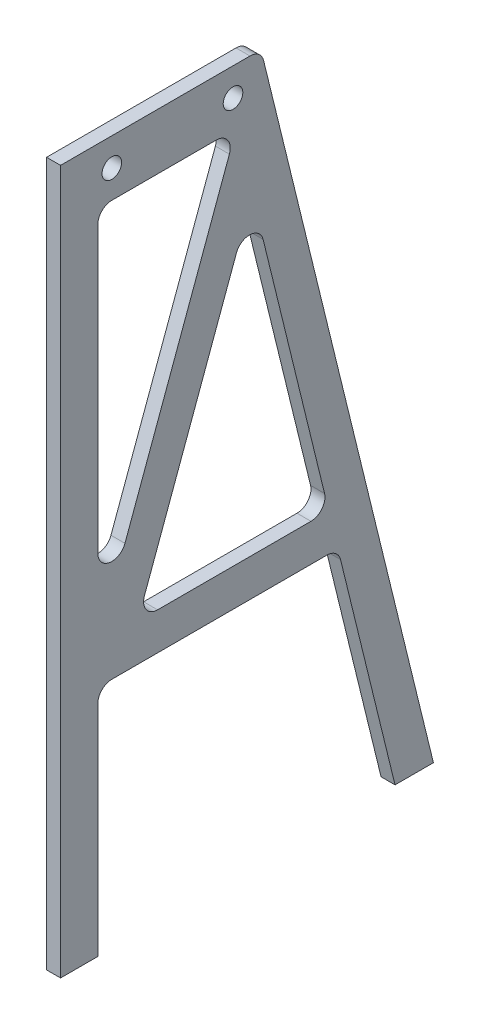
ISO-10303-21;
HEADER;
FILE_DESCRIPTION(('STEP AP214'),'2;1');
FILE_NAME('part.step','',(''),(''),'','','');
FILE_SCHEMA(('AUTOMOTIVE_DESIGN { 1 0 10303 214 1 1 1 1 }'));
ENDSEC;
DATA;
#1=APPLICATION_CONTEXT('core data for automotive mechanical design processes');
#2=APPLICATION_PROTOCOL_DEFINITION('international standard','automotive_design',2000,#1);
#3=PRODUCT_CONTEXT('',#1,'mechanical');
#4=PRODUCT('Part','Part','',(#3));
#5=PRODUCT_RELATED_PRODUCT_CATEGORY('part','',(#4));
#6=PRODUCT_DEFINITION_FORMATION('','',#4);
#7=PRODUCT_DEFINITION_CONTEXT('part definition',#1,'design');
#8=PRODUCT_DEFINITION('design','',#6,#7);
#9=PRODUCT_DEFINITION_SHAPE('','',#8);
#10=(LENGTH_UNIT() NAMED_UNIT(*) SI_UNIT(.MILLI.,.METRE.));
#11=(NAMED_UNIT(*) PLANE_ANGLE_UNIT() SI_UNIT($,.RADIAN.));
#12=(NAMED_UNIT(*) SI_UNIT($,.STERADIAN.) SOLID_ANGLE_UNIT());
#13=UNCERTAINTY_MEASURE_WITH_UNIT(LENGTH_MEASURE(1.E-05),#10,'distance_accuracy_value','');
#14=(GEOMETRIC_REPRESENTATION_CONTEXT(3) GLOBAL_UNCERTAINTY_ASSIGNED_CONTEXT((#13)) GLOBAL_UNIT_ASSIGNED_CONTEXT((#10,
#11,#12)) REPRESENTATION_CONTEXT('',''));
#15=CARTESIAN_POINT('',(0.,0.,0.));
#16=DIRECTION('',(0.,0.,1.));
#17=DIRECTION('',(1.,0.,0.));
#18=AXIS2_PLACEMENT_3D('',#15,#16,#17);
#19=CARTESIAN_POINT('',(1.5,0.,0.));
#20=DIRECTION('',(-1.,0.,0.));
#21=DIRECTION('',(0.,0.,1.));
#22=AXIS2_PLACEMENT_3D('',#19,#20,#21);
#23=PLANE('',#22);
#24=DIRECTION('',(0.,-1.,0.));
#25=VECTOR('',#24,1.);
#26=CARTESIAN_POINT('',(1.5,29.,-4.));
#27=LINE('',#26,#25);
#28=CARTESIAN_POINT('',(1.5,68.,-3.99999999999999));
#29=VERTEX_POINT('',#28);
#30=CARTESIAN_POINT('',(1.5,37.4471518851589,-3.99999999999999));
#31=VERTEX_POINT('',#30);
#32=EDGE_CURVE('E380',#29,#31,#27,.T.);
#33=ORIENTED_EDGE('',*,*,#32,.F.);
#34=CARTESIAN_POINT('',(1.5,68.,-5.49999999999999));
#35=DIRECTION('',(-1.,0.,0.));
#36=DIRECTION('',(0.,0.,1.));
#37=AXIS2_PLACEMENT_3D('',#34,#35,#36);
#38=CIRCLE('',#37,1.5);
#39=CARTESIAN_POINT('',(1.5,69.5,-5.49999999999999));
#40=VERTEX_POINT('',#39);
#41=EDGE_CURVE('E328',#29,#40,#38,.T.);
#42=ORIENTED_EDGE('',*,*,#41,.T.);
#43=DIRECTION('',(0.,0.,1.));
#44=VECTOR('',#43,1.);
#45=CARTESIAN_POINT('',(1.5,69.5,-3.99999999999999));
#46=LINE('',#45,#44);
#47=CARTESIAN_POINT('',(1.5,69.5,-16.7041190731602));
#48=VERTEX_POINT('',#47);
#49=EDGE_CURVE('E389',#48,#40,#46,.T.);
#50=ORIENTED_EDGE('',*,*,#49,.F.);
#51=CARTESIAN_POINT('',(1.5,68.,-16.7041190731602));
#52=DIRECTION('',(-1.,0.,0.));
#53=DIRECTION('',(0.,0.,1.));
#54=AXIS2_PLACEMENT_3D('',#51,#52,#53);
#55=CIRCLE('',#54,1.5);
#56=CARTESIAN_POINT('',(1.5,67.4835608141741,-18.112412567906));
#57=VERTEX_POINT('',#56);
#58=EDGE_CURVE('E334',#48,#57,#55,.T.);
#59=ORIENTED_EDGE('',*,*,#58,.T.);
#60=DIRECTION('',(0.,0.938862329830578,-0.34429279055057));
#61=VECTOR('',#60,1.);
#62=CARTESIAN_POINT('',(1.5,69.5,-18.8518665349097));
#63=LINE('',#62,#61);
#64=CARTESIAN_POINT('',(1.5,36.930712699333,-6.90829349474586));
#65=VERTEX_POINT('',#64);
#66=EDGE_CURVE('E384',#65,#57,#63,.T.);
#67=ORIENTED_EDGE('',*,*,#66,.F.);
#68=CARTESIAN_POINT('',(1.5,37.4471518851589,-5.5));
#69=DIRECTION('',(-1.,0.,0.));
#70=DIRECTION('',(0.,0.,1.));
#71=AXIS2_PLACEMENT_3D('',#68,#69,#70);
#72=CIRCLE('',#71,1.5);
#73=EDGE_CURVE('E304',#65,#31,#72,.T.);
#74=ORIENTED_EDGE('',*,*,#73,.T.);
#75=EDGE_LOOP('',(#33,#42,#50,#59,#67,#74));
#76=FACE_BOUND('',#75,.T.);
#77=DIRECTION('',(0.,0.971266974943367,0.237992570019236));
#78=VECTOR('',#77,1.);
#79=CARTESIAN_POINT('',(1.5,75.5,-21.5));
#80=LINE('',#79,#78);
#81=CARTESIAN_POINT('',(1.5,0.,-40.));
#82=VERTEX_POINT('',#81);
#83=CARTESIAN_POINT('',(1.5,74.3569888550288,-21.7800755785691));
#84=VERTEX_POINT('',#83);
#85=EDGE_CURVE('E428',#82,#84,#80,.T.);
#86=ORIENTED_EDGE('',*,*,#85,.T.);
#87=CARTESIAN_POINT('',(1.5,74.,-20.323175116154));
#88=DIRECTION('',(-1.,0.,0.));
#89=DIRECTION('',(0.,0.,1.));
#90=AXIS2_PLACEMENT_3D('',#87,#88,#89);
#91=CIRCLE('',#90,1.5);
#92=CARTESIAN_POINT('',(1.5,75.5,-20.323175116154));
#93=VERTEX_POINT('',#92);
#94=EDGE_CURVE('E244',#84,#93,#91,.F.);
#95=ORIENTED_EDGE('',*,*,#94,.T.);
#96=DIRECTION('',(0.,0.,1.));
#97=VECTOR('',#96,1.);
#98=CARTESIAN_POINT('',(1.5,75.5,-21.5));
#99=LINE('',#98,#97);
#100=CARTESIAN_POINT('',(1.5,75.5,0.));
#101=VERTEX_POINT('',#100);
#102=EDGE_CURVE('E431',#93,#101,#99,.T.);
#103=ORIENTED_EDGE('',*,*,#102,.T.);
#104=DIRECTION('',(0.,-1.,0.));
#105=VECTOR('',#104,1.);
#106=CARTESIAN_POINT('',(1.5,0.,0.));
#107=LINE('',#106,#105);
#108=CARTESIAN_POINT('',(1.5,0.,0.));
#109=VERTEX_POINT('',#108);
#110=EDGE_CURVE('E215',#101,#109,#107,.T.);
#111=ORIENTED_EDGE('',*,*,#110,.T.);
#112=DIRECTION('',(0.,0.,-1.));
#113=VECTOR('',#112,1.);
#114=CARTESIAN_POINT('',(1.5,0.,-4.));
#115=LINE('',#114,#113);
#116=CARTESIAN_POINT('',(1.5,0.,-4.));
#117=VERTEX_POINT('',#116);
#118=EDGE_CURVE('E209',#109,#117,#115,.T.);
#119=ORIENTED_EDGE('',*,*,#118,.T.);
#120=DIRECTION('',(0.,1.,0.));
#121=VECTOR('',#120,1.);
#122=CARTESIAN_POINT('',(1.5,25.,-4.));
#123=LINE('',#122,#121);
#124=CARTESIAN_POINT('',(1.5,23.5,-4.));
#125=VERTEX_POINT('',#124);
#126=EDGE_CURVE('E196',#117,#125,#123,.T.);
#127=ORIENTED_EDGE('',*,*,#126,.T.);
#128=CARTESIAN_POINT('',(1.5,23.5,-5.5));
#129=DIRECTION('',(-1.,0.,0.));
#130=DIRECTION('',(0.,0.,1.));
#131=AXIS2_PLACEMENT_3D('',#128,#129,#130);
#132=CIRCLE('',#131,1.5);
#133=CARTESIAN_POINT('',(1.5,25.,-5.50000000000001));
#134=VERTEX_POINT('',#133);
#135=EDGE_CURVE('E322',#125,#134,#132,.T.);
#136=ORIENTED_EDGE('',*,*,#135,.T.);
#137=DIRECTION('',(0.,0.,-1.));
#138=VECTOR('',#137,1.);
#139=CARTESIAN_POINT('',(1.5,25.,-29.7558400448434));
#140=LINE('',#139,#138);
#141=CARTESIAN_POINT('',(1.5,25.,-28.5790151609975));
#142=VERTEX_POINT('',#141);
#143=EDGE_CURVE('E208',#134,#142,#140,.T.);
#144=ORIENTED_EDGE('',*,*,#143,.T.);
#145=CARTESIAN_POINT('',(1.5,23.5,-28.5790151609975));
#146=DIRECTION('',(-1.,0.,0.));
#147=DIRECTION('',(0.,0.,1.));
#148=AXIS2_PLACEMENT_3D('',#145,#146,#147);
#149=CIRCLE('',#148,1.5);
#150=CARTESIAN_POINT('',(1.5,23.8569888550289,-30.0359156234125));
#151=VERTEX_POINT('',#150);
#152=EDGE_CURVE('E316',#142,#151,#149,.T.);
#153=ORIENTED_EDGE('',*,*,#152,.T.);
#154=DIRECTION('',(0.,-0.971266974943367,-0.237992570019236));
#155=VECTOR('',#154,1.);
#156=CARTESIAN_POINT('',(1.5,0.,-35.881667859413));
#157=LINE('',#156,#155);
#158=CARTESIAN_POINT('',(1.5,0.,-35.881667859413));
#159=VERTEX_POINT('',#158);
#160=EDGE_CURVE('E422',#151,#159,#157,.T.);
#161=ORIENTED_EDGE('',*,*,#160,.T.);
#162=DIRECTION('',(0.,0.,-1.));
#163=VECTOR('',#162,1.);
#164=CARTESIAN_POINT('',(1.5,0.,-40.));
#165=LINE('',#164,#163);
#166=EDGE_CURVE('E425',#159,#82,#165,.T.);
#167=ORIENTED_EDGE('',*,*,#166,.T.);
#168=EDGE_LOOP('',(#86,#95,#103,#111,#119,#127,#136,#144,#153,#161,#167));
#169=FACE_BOUND('',#168,.T.);
#170=CARTESIAN_POINT('',(1.5,72.5,-5.5));
#171=DIRECTION('',(1.,0.,0.));
#172=DIRECTION('',(0.,0.,-1.));
#173=AXIS2_PLACEMENT_3D('',#170,#171,#172);
#174=CIRCLE('',#173,1.04999999999999);
#175=CARTESIAN_POINT('',(1.5,72.5,-6.54999999999999));
#176=VERTEX_POINT('',#175);
#177=EDGE_CURVE('E412',#176,#176,#174,.T.);
#178=ORIENTED_EDGE('',*,*,#177,.F.);
#179=EDGE_LOOP('',(#178));
#180=FACE_BOUND('',#179,.T.);
#181=CARTESIAN_POINT('',(1.5,72.5,-18.5));
#182=DIRECTION('',(1.,0.,0.));
#183=DIRECTION('',(0.,0.,-1.));
#184=AXIS2_PLACEMENT_3D('',#181,#182,#183);
#185=CIRCLE('',#184,1.05);
#186=CARTESIAN_POINT('',(1.5,72.5,-19.55));
#187=VERTEX_POINT('',#186);
#188=EDGE_CURVE('E404',#187,#187,#185,.T.);
#189=ORIENTED_EDGE('',*,*,#188,.F.);
#190=EDGE_LOOP('',(#189));
#191=FACE_BOUND('',#190,.T.);
#192=DIRECTION('',(0.,0.,-1.));
#193=VECTOR('',#192,1.);
#194=CARTESIAN_POINT('',(1.5,29.,-28.7757075945123));
#195=LINE('',#194,#193);
#196=CARTESIAN_POINT('',(1.5,29.,-10.4082230106213));
#197=VERTEX_POINT('',#196);
#198=CARTESIAN_POINT('',(1.5,29.,-26.863783372918));
#199=VERTEX_POINT('',#198);
#200=EDGE_CURVE('E359',#197,#199,#195,.T.);
#201=ORIENTED_EDGE('',*,*,#200,.F.);
#202=CARTESIAN_POINT('',(1.5,30.5,-10.4082230106213));
#203=DIRECTION('',(-1.,0.,0.));
#204=DIRECTION('',(0.,0.,1.));
#205=AXIS2_PLACEMENT_3D('',#202,#203,#204);
#206=CIRCLE('',#205,1.5);
#207=CARTESIAN_POINT('',(1.5,31.0164391858259,-8.99992951587546));
#208=VERTEX_POINT('',#207);
#209=EDGE_CURVE('E310',#197,#208,#206,.T.);
#210=ORIENTED_EDGE('',*,*,#209,.T.);
#211=DIRECTION('',(0.,-0.938862329830578,0.34429279055057));
#212=VECTOR('',#211,1.);
#213=CARTESIAN_POINT('',(1.5,29.,-8.26047554887181));
#214=LINE('',#213,#212);
#215=CARTESIAN_POINT('',(1.5,57.915779684203,-18.8642607494307));
#216=VERTEX_POINT('',#215);
#217=EDGE_CURVE('E369',#216,#208,#214,.T.);
#218=ORIENTED_EDGE('',*,*,#217,.F.);
#219=CARTESIAN_POINT('',(1.5,57.3993404983772,-20.2725542441766));
#220=DIRECTION('',(-1.,0.,0.));
#221=DIRECTION('',(0.,0.,1.));
#222=AXIS2_PLACEMENT_3D('',#219,#220,#221);
#223=CIRCLE('',#222,1.5);
#224=CARTESIAN_POINT('',(1.5,57.756329353406,-21.7294547065916));
#225=VERTEX_POINT('',#224);
#226=EDGE_CURVE('E55',#216,#225,#223,.T.);
#227=ORIENTED_EDGE('',*,*,#226,.T.);
#228=DIRECTION('',(0.,0.971266974943367,0.237992570019236));
#229=VECTOR('',#228,1.);
#230=CARTESIAN_POINT('',(1.5,62.5355466510459,-20.5583882164415));
#231=LINE('',#230,#229);
#232=CARTESIAN_POINT('',(1.5,30.8569888550289,-28.3206838353331));
#233=VERTEX_POINT('',#232);
#234=EDGE_CURVE('E361',#233,#225,#231,.T.);
#235=ORIENTED_EDGE('',*,*,#234,.F.);
#236=CARTESIAN_POINT('',(1.5,30.5,-26.863783372918));
#237=DIRECTION('',(-1.,0.,0.));
#238=DIRECTION('',(0.,0.,1.));
#239=AXIS2_PLACEMENT_3D('',#236,#237,#238);
#240=CIRCLE('',#239,1.5);
#241=EDGE_CURVE('E11',#233,#199,#240,.T.);
#242=ORIENTED_EDGE('',*,*,#241,.T.);
#243=EDGE_LOOP('',(#201,#210,#218,#227,#235,#242));
#244=FACE_BOUND('',#243,.T.);
#245=ADVANCED_FACE('F39',(#76,#169,#180,#191,#244),#23,.F.);
#246=CARTESIAN_POINT('',(0.,0.,0.));
#247=DIRECTION('',(-1.,0.,0.));
#248=DIRECTION('',(0.,0.,1.));
#249=AXIS2_PLACEMENT_3D('',#246,#247,#248);
#250=PLANE('',#249);
#251=CARTESIAN_POINT('',(0.,72.5,-5.5));
#252=DIRECTION('',(1.,0.,0.));
#253=DIRECTION('',(0.,0.,-1.));
#254=AXIS2_PLACEMENT_3D('',#251,#252,#253);
#255=CIRCLE('',#254,1.04999999999999);
#256=CARTESIAN_POINT('',(0.,72.5,-6.54999999999999));
#257=VERTEX_POINT('',#256);
#258=EDGE_CURVE('E408',#257,#257,#255,.T.);
#259=ORIENTED_EDGE('',*,*,#258,.T.);
#260=EDGE_LOOP('',(#259));
#261=FACE_BOUND('',#260,.T.);
#262=DIRECTION('',(0.,0.,1.));
#263=VECTOR('',#262,1.);
#264=CARTESIAN_POINT('',(0.,75.5,-21.5));
#265=LINE('',#264,#263);
#266=CARTESIAN_POINT('',(0.,75.5,-20.323175116154));
#267=VERTEX_POINT('',#266);
#268=CARTESIAN_POINT('',(0.,75.5,0.));
#269=VERTEX_POINT('',#268);
#270=EDGE_CURVE('E456',#267,#269,#265,.T.);
#271=ORIENTED_EDGE('',*,*,#270,.F.);
#272=CARTESIAN_POINT('',(0.,74.,-20.323175116154));
#273=DIRECTION('',(-1.,0.,0.));
#274=DIRECTION('',(0.,0.,1.));
#275=AXIS2_PLACEMENT_3D('',#272,#273,#274);
#276=CIRCLE('',#275,1.5);
#277=CARTESIAN_POINT('',(0.,74.3569888550288,-21.7800755785691));
#278=VERTEX_POINT('',#277);
#279=EDGE_CURVE('E232',#267,#278,#276,.T.);
#280=ORIENTED_EDGE('',*,*,#279,.T.);
#281=DIRECTION('',(0.,0.971266974943367,0.237992570019236));
#282=VECTOR('',#281,1.);
#283=CARTESIAN_POINT('',(0.,75.5,-21.5));
#284=LINE('',#283,#282);
#285=CARTESIAN_POINT('',(0.,0.,-40.));
#286=VERTEX_POINT('',#285);
#287=EDGE_CURVE('E452',#286,#278,#284,.T.);
#288=ORIENTED_EDGE('',*,*,#287,.F.);
#289=DIRECTION('',(0.,0.,-1.));
#290=VECTOR('',#289,1.);
#291=CARTESIAN_POINT('',(0.,0.,-40.));
#292=LINE('',#291,#290);
#293=CARTESIAN_POINT('',(0.,0.,-35.881667859413));
#294=VERTEX_POINT('',#293);
#295=EDGE_CURVE('E449',#294,#286,#292,.T.);
#296=ORIENTED_EDGE('',*,*,#295,.F.);
#297=DIRECTION('',(0.,-0.971266974943367,-0.237992570019236));
#298=VECTOR('',#297,1.);
#299=CARTESIAN_POINT('',(0.,0.,-35.881667859413));
#300=LINE('',#299,#298);
#301=CARTESIAN_POINT('',(0.,23.8569888550289,-30.0359156234125));
#302=VERTEX_POINT('',#301);
#303=EDGE_CURVE('E446',#302,#294,#300,.T.);
#304=ORIENTED_EDGE('',*,*,#303,.F.);
#305=CARTESIAN_POINT('',(0.,23.5,-28.5790151609975));
#306=DIRECTION('',(-1.,0.,0.));
#307=DIRECTION('',(0.,0.,1.));
#308=AXIS2_PLACEMENT_3D('',#305,#306,#307);
#309=CIRCLE('',#308,1.5);
#310=CARTESIAN_POINT('',(0.,25.,-28.5790151609975));
#311=VERTEX_POINT('',#310);
#312=EDGE_CURVE('E313',#302,#311,#309,.F.);
#313=ORIENTED_EDGE('',*,*,#312,.T.);
#314=DIRECTION('',(0.,0.,-1.));
#315=VECTOR('',#314,1.);
#316=CARTESIAN_POINT('',(0.,25.,-29.7558400448434));
#317=LINE('',#316,#315);
#318=CARTESIAN_POINT('',(0.,25.,-5.50000000000001));
#319=VERTEX_POINT('',#318);
#320=EDGE_CURVE('E442',#319,#311,#317,.T.);
#321=ORIENTED_EDGE('',*,*,#320,.F.);
#322=CARTESIAN_POINT('',(0.,23.5,-5.5));
#323=DIRECTION('',(-1.,0.,0.));
#324=DIRECTION('',(0.,0.,1.));
#325=AXIS2_PLACEMENT_3D('',#322,#323,#324);
#326=CIRCLE('',#325,1.5);
#327=CARTESIAN_POINT('',(0.,23.5,-4.));
#328=VERTEX_POINT('',#327);
#329=EDGE_CURVE('E319',#319,#328,#326,.F.);
#330=ORIENTED_EDGE('',*,*,#329,.T.);
#331=DIRECTION('',(0.,1.,0.));
#332=VECTOR('',#331,1.);
#333=CARTESIAN_POINT('',(0.,25.,-4.));
#334=LINE('',#333,#332);
#335=CARTESIAN_POINT('',(0.,0.,-4.));
#336=VERTEX_POINT('',#335);
#337=EDGE_CURVE('E439',#336,#328,#334,.T.);
#338=ORIENTED_EDGE('',*,*,#337,.F.);
#339=DIRECTION('',(0.,0.,-1.));
#340=VECTOR('',#339,1.);
#341=CARTESIAN_POINT('',(0.,0.,-4.));
#342=LINE('',#341,#340);
#343=CARTESIAN_POINT('',(0.,0.,0.));
#344=VERTEX_POINT('',#343);
#345=EDGE_CURVE('E224',#344,#336,#342,.T.);
#346=ORIENTED_EDGE('',*,*,#345,.F.);
#347=DIRECTION('',(0.,-1.,0.));
#348=VECTOR('',#347,1.);
#349=CARTESIAN_POINT('',(0.,0.,0.));
#350=LINE('',#349,#348);
#351=EDGE_CURVE('E220',#269,#344,#350,.T.);
#352=ORIENTED_EDGE('',*,*,#351,.F.);
#353=EDGE_LOOP('',(#271,#280,#288,#296,#304,#313,#321,#330,#338,#346,#352));
#354=FACE_BOUND('',#353,.T.);
#355=CARTESIAN_POINT('',(0.,72.5,-18.5));
#356=DIRECTION('',(1.,0.,0.));
#357=DIRECTION('',(0.,0.,-1.));
#358=AXIS2_PLACEMENT_3D('',#355,#356,#357);
#359=CIRCLE('',#358,1.05);
#360=CARTESIAN_POINT('',(0.,72.5,-19.55));
#361=VERTEX_POINT('',#360);
#362=EDGE_CURVE('E393',#361,#361,#359,.T.);
#363=ORIENTED_EDGE('',*,*,#362,.T.);
#364=EDGE_LOOP('',(#363));
#365=FACE_BOUND('',#364,.T.);
#366=DIRECTION('',(0.,0.938862329830578,-0.34429279055057));
#367=VECTOR('',#366,1.);
#368=CARTESIAN_POINT('',(0.,69.5,-18.8518665349097));
#369=LINE('',#368,#367);
#370=CARTESIAN_POINT('',(0.,36.930712699333,-6.90829349474586));
#371=VERTEX_POINT('',#370);
#372=CARTESIAN_POINT('',(0.,67.4835608141741,-18.112412567906));
#373=VERTEX_POINT('',#372);
#374=EDGE_CURVE('E397',#371,#373,#369,.T.);
#375=ORIENTED_EDGE('',*,*,#374,.T.);
#376=CARTESIAN_POINT('',(0.,68.,-16.7041190731602));
#377=DIRECTION('',(-1.,0.,0.));
#378=DIRECTION('',(0.,0.,1.));
#379=AXIS2_PLACEMENT_3D('',#376,#377,#378);
#380=CIRCLE('',#379,1.5);
#381=CARTESIAN_POINT('',(0.,69.5,-16.7041190731602));
#382=VERTEX_POINT('',#381);
#383=EDGE_CURVE('E331',#373,#382,#380,.F.);
#384=ORIENTED_EDGE('',*,*,#383,.T.);
#385=DIRECTION('',(0.,0.,1.));
#386=VECTOR('',#385,1.);
#387=CARTESIAN_POINT('',(0.,69.5,-3.99999999999999));
#388=LINE('',#387,#386);
#389=CARTESIAN_POINT('',(0.,69.5,-5.49999999999999));
#390=VERTEX_POINT('',#389);
#391=EDGE_CURVE('E385',#382,#390,#388,.T.);
#392=ORIENTED_EDGE('',*,*,#391,.T.);
#393=CARTESIAN_POINT('',(0.,68.,-5.49999999999999));
#394=DIRECTION('',(-1.,0.,0.));
#395=DIRECTION('',(0.,0.,1.));
#396=AXIS2_PLACEMENT_3D('',#393,#394,#395);
#397=CIRCLE('',#396,1.5);
#398=CARTESIAN_POINT('',(0.,68.,-3.99999999999999));
#399=VERTEX_POINT('',#398);
#400=EDGE_CURVE('E325',#390,#399,#397,.F.);
#401=ORIENTED_EDGE('',*,*,#400,.T.);
#402=DIRECTION('',(0.,-1.,0.));
#403=VECTOR('',#402,1.);
#404=CARTESIAN_POINT('',(0.,29.,-4.));
#405=LINE('',#404,#403);
#406=CARTESIAN_POINT('',(0.,37.4471518851589,-3.99999999999999));
#407=VERTEX_POINT('',#406);
#408=EDGE_CURVE('E377',#399,#407,#405,.T.);
#409=ORIENTED_EDGE('',*,*,#408,.T.);
#410=CARTESIAN_POINT('',(0.,37.4471518851589,-5.5));
#411=DIRECTION('',(-1.,0.,0.));
#412=DIRECTION('',(0.,0.,1.));
#413=AXIS2_PLACEMENT_3D('',#410,#411,#412);
#414=CIRCLE('',#413,1.5);
#415=EDGE_CURVE('E301',#407,#371,#414,.F.);
#416=ORIENTED_EDGE('',*,*,#415,.T.);
#417=EDGE_LOOP('',(#375,#384,#392,#401,#409,#416));
#418=FACE_BOUND('',#417,.T.);
#419=DIRECTION('',(0.,0.971266974943367,0.237992570019236));
#420=VECTOR('',#419,1.);
#421=CARTESIAN_POINT('',(0.,62.5355466510459,-20.5583882164415));
#422=LINE('',#421,#420);
#423=CARTESIAN_POINT('',(0.,30.8569888550289,-28.3206838353331));
#424=VERTEX_POINT('',#423);
#425=CARTESIAN_POINT('',(0.,57.756329353406,-21.7294547065916));
#426=VERTEX_POINT('',#425);
#427=EDGE_CURVE('E346',#424,#426,#422,.T.);
#428=ORIENTED_EDGE('',*,*,#427,.T.);
#429=CARTESIAN_POINT('',(0.,57.3993404983772,-20.2725542441766));
#430=DIRECTION('',(-1.,0.,0.));
#431=DIRECTION('',(0.,0.,1.));
#432=AXIS2_PLACEMENT_3D('',#429,#430,#431);
#433=CIRCLE('',#432,1.5);
#434=CARTESIAN_POINT('',(0.,57.915779684203,-18.8642607494307));
#435=VERTEX_POINT('',#434);
#436=EDGE_CURVE('E337',#426,#435,#433,.F.);
#437=ORIENTED_EDGE('',*,*,#436,.T.);
#438=DIRECTION('',(0.,-0.938862329830578,0.34429279055057));
#439=VECTOR('',#438,1.);
#440=CARTESIAN_POINT('',(0.,29.,-8.26047554887181));
#441=LINE('',#440,#439);
#442=CARTESIAN_POINT('',(0.,31.0164391858259,-8.99992951587546));
#443=VERTEX_POINT('',#442);
#444=EDGE_CURVE('E354',#435,#443,#441,.T.);
#445=ORIENTED_EDGE('',*,*,#444,.T.);
#446=CARTESIAN_POINT('',(0.,30.5,-10.4082230106213));
#447=DIRECTION('',(-1.,0.,0.));
#448=DIRECTION('',(0.,0.,1.));
#449=AXIS2_PLACEMENT_3D('',#446,#447,#448);
#450=CIRCLE('',#449,1.5);
#451=CARTESIAN_POINT('',(0.,29.,-10.4082230106213));
#452=VERTEX_POINT('',#451);
#453=EDGE_CURVE('E307',#443,#452,#450,.F.);
#454=ORIENTED_EDGE('',*,*,#453,.T.);
#455=DIRECTION('',(0.,0.,-1.));
#456=VECTOR('',#455,1.);
#457=CARTESIAN_POINT('',(0.,29.,-28.7757075945123));
#458=LINE('',#457,#456);
#459=CARTESIAN_POINT('',(0.,29.,-26.863783372918));
#460=VERTEX_POINT('',#459);
#461=EDGE_CURVE('E348',#452,#460,#458,.T.);
#462=ORIENTED_EDGE('',*,*,#461,.T.);
#463=CARTESIAN_POINT('',(0.,30.5,-26.863783372918));
#464=DIRECTION('',(-1.,0.,0.));
#465=DIRECTION('',(0.,0.,1.));
#466=AXIS2_PLACEMENT_3D('',#463,#464,#465);
#467=CIRCLE('',#466,1.5);
#468=EDGE_CURVE('E48',#460,#424,#467,.F.);
#469=ORIENTED_EDGE('',*,*,#468,.T.);
#470=EDGE_LOOP('',(#428,#437,#445,#454,#462,#469));
#471=FACE_BOUND('',#470,.T.);
#472=ADVANCED_FACE('F345',(#261,#354,#365,#418,#471),#250,.T.);
#473=CARTESIAN_POINT('',(1.5,0.,-4.));
#474=DIRECTION('',(0.,1.,0.));
#475=DIRECTION('',(0.,0.,1.));
#476=AXIS2_PLACEMENT_3D('',#473,#474,#475);
#477=PLANE('',#476);
#478=ORIENTED_EDGE('',*,*,#345,.T.);
#479=DIRECTION('',(-1.,0.,0.));
#480=VECTOR('',#479,1.);
#481=CARTESIAN_POINT('',(1.5,0.,-4.));
#482=LINE('',#481,#480);
#483=EDGE_CURVE('E201',#117,#336,#482,.T.);
#484=ORIENTED_EDGE('',*,*,#483,.F.);
#485=ORIENTED_EDGE('',*,*,#118,.F.);
#486=DIRECTION('',(-1.,0.,0.));
#487=VECTOR('',#486,1.);
#488=CARTESIAN_POINT('',(1.5,0.,0.));
#489=LINE('',#488,#487);
#490=EDGE_CURVE('E436',#109,#344,#489,.T.);
#491=ORIENTED_EDGE('',*,*,#490,.T.);
#492=EDGE_LOOP('',(#478,#484,#485,#491));
#493=FACE_BOUND('',#492,.T.);
#494=ADVANCED_FACE('F222',(#493),#477,.F.);
#495=CARTESIAN_POINT('',(1.5,25.,-4.));
#496=DIRECTION('',(0.,0.,1.));
#497=DIRECTION('',(0.,-1.,0.));
#498=AXIS2_PLACEMENT_3D('',#495,#496,#497);
#499=PLANE('',#498);
#500=ORIENTED_EDGE('',*,*,#337,.T.);
#501=DIRECTION('',(-1.,0.,0.));
#502=VECTOR('',#501,1.);
#503=CARTESIAN_POINT('',(1.5,23.5,-4.));
#504=LINE('',#503,#502);
#505=EDGE_CURVE('E204',#328,#125,#504,.F.);
#506=ORIENTED_EDGE('',*,*,#505,.T.);
#507=ORIENTED_EDGE('',*,*,#126,.F.);
#508=ORIENTED_EDGE('',*,*,#483,.T.);
#509=EDGE_LOOP('',(#500,#506,#507,#508));
#510=FACE_BOUND('',#509,.T.);
#511=ADVANCED_FACE('F199',(#510),#499,.F.);
#512=CARTESIAN_POINT('',(1.5,25.,-29.7558400448434));
#513=DIRECTION('',(0.,1.,0.));
#514=DIRECTION('',(0.,0.,1.));
#515=AXIS2_PLACEMENT_3D('',#512,#513,#514);
#516=PLANE('',#515);
#517=ORIENTED_EDGE('',*,*,#320,.T.);
#518=DIRECTION('',(-1.,0.,0.));
#519=VECTOR('',#518,1.);
#520=CARTESIAN_POINT('',(1.5,25.,-28.5790151609975));
#521=LINE('',#520,#519);
#522=EDGE_CURVE('E283',#311,#142,#521,.F.);
#523=ORIENTED_EDGE('',*,*,#522,.T.);
#524=ORIENTED_EDGE('',*,*,#143,.F.);
#525=DIRECTION('',(-1.,0.,0.));
#526=VECTOR('',#525,1.);
#527=CARTESIAN_POINT('',(0.,25.,-5.5));
#528=LINE('',#527,#526);
#529=EDGE_CURVE('E279',#134,#319,#528,.T.);
#530=ORIENTED_EDGE('',*,*,#529,.T.);
#531=EDGE_LOOP('',(#517,#523,#524,#530));
#532=FACE_BOUND('',#531,.T.);
#533=ADVANCED_FACE('F500',(#532),#516,.F.);
#534=CARTESIAN_POINT('',(1.5,0.,-35.881667859413));
#535=DIRECTION('',(0.,0.237992570019236,-0.971266974943367));
#536=DIRECTION('',(0.,0.971266974943367,0.237992570019236));
#537=AXIS2_PLACEMENT_3D('',#534,#535,#536);
#538=PLANE('',#537);
#539=ORIENTED_EDGE('',*,*,#160,.F.);
#540=DIRECTION('',(-1.,0.,0.));
#541=VECTOR('',#540,1.);
#542=CARTESIAN_POINT('',(0.,23.8569888550289,-30.0359156234125));
#543=LINE('',#542,#541);
#544=EDGE_CURVE('E275',#151,#302,#543,.T.);
#545=ORIENTED_EDGE('',*,*,#544,.T.);
#546=ORIENTED_EDGE('',*,*,#303,.T.);
#547=DIRECTION('',(-1.,0.,0.));
#548=VECTOR('',#547,1.);
#549=CARTESIAN_POINT('',(1.5,0.,-35.881667859413));
#550=LINE('',#549,#548);
#551=EDGE_CURVE('E227',#159,#294,#550,.T.);
#552=ORIENTED_EDGE('',*,*,#551,.F.);
#553=EDGE_LOOP('',(#539,#545,#546,#552));
#554=FACE_BOUND('',#553,.T.);
#555=ADVANCED_FACE('F494',(#554),#538,.F.);
#556=CARTESIAN_POINT('',(1.5,0.,-40.));
#557=DIRECTION('',(0.,1.,0.));
#558=DIRECTION('',(0.,0.,1.));
#559=AXIS2_PLACEMENT_3D('',#556,#557,#558);
#560=PLANE('',#559);
#561=ORIENTED_EDGE('',*,*,#295,.T.);
#562=DIRECTION('',(-1.,0.,0.));
#563=VECTOR('',#562,1.);
#564=CARTESIAN_POINT('',(1.5,0.,-40.));
#565=LINE('',#564,#563);
#566=EDGE_CURVE('E235',#82,#286,#565,.T.);
#567=ORIENTED_EDGE('',*,*,#566,.F.);
#568=ORIENTED_EDGE('',*,*,#166,.F.);
#569=ORIENTED_EDGE('',*,*,#551,.T.);
#570=EDGE_LOOP('',(#561,#567,#568,#569));
#571=FACE_BOUND('',#570,.T.);
#572=ADVANCED_FACE('F492',(#571),#560,.F.);
#573=CARTESIAN_POINT('',(1.5,75.5,-21.5));
#574=DIRECTION('',(0.,-0.237992570019236,0.971266974943367));
#575=DIRECTION('',(0.,-0.971266974943367,-0.237992570019236));
#576=AXIS2_PLACEMENT_3D('',#573,#574,#575);
#577=PLANE('',#576);
#578=ORIENTED_EDGE('',*,*,#287,.T.);
#579=DIRECTION('',(-1.,0.,0.));
#580=VECTOR('',#579,1.);
#581=CARTESIAN_POINT('',(1.5,74.3569888550288,-21.7800755785691));
#582=LINE('',#581,#580);
#583=EDGE_CURVE('E241',#278,#84,#582,.F.);
#584=ORIENTED_EDGE('',*,*,#583,.T.);
#585=ORIENTED_EDGE('',*,*,#85,.F.);
#586=ORIENTED_EDGE('',*,*,#566,.T.);
#587=EDGE_LOOP('',(#578,#584,#585,#586));
#588=FACE_BOUND('',#587,.T.);
#589=ADVANCED_FACE('F472',(#588),#577,.F.);
#590=CARTESIAN_POINT('',(1.5,75.5,-21.5));
#591=DIRECTION('',(0.,-1.,0.));
#592=DIRECTION('',(0.,0.,-1.));
#593=AXIS2_PLACEMENT_3D('',#590,#591,#592);
#594=PLANE('',#593);
#595=ORIENTED_EDGE('',*,*,#102,.F.);
#596=DIRECTION('',(-1.,0.,0.));
#597=VECTOR('',#596,1.);
#598=CARTESIAN_POINT('',(1.5,75.5,-20.323175116154));
#599=LINE('',#598,#597);
#600=EDGE_CURVE('E226',#93,#267,#599,.T.);
#601=ORIENTED_EDGE('',*,*,#600,.T.);
#602=ORIENTED_EDGE('',*,*,#270,.T.);
#603=DIRECTION('',(-1.,0.,0.));
#604=VECTOR('',#603,1.);
#605=CARTESIAN_POINT('',(1.5,75.5,0.));
#606=LINE('',#605,#604);
#607=EDGE_CURVE('E463',#101,#269,#606,.T.);
#608=ORIENTED_EDGE('',*,*,#607,.F.);
#609=EDGE_LOOP('',(#595,#601,#602,#608));
#610=FACE_BOUND('',#609,.T.);
#611=ADVANCED_FACE('F488',(#610),#594,.F.);
#612=CARTESIAN_POINT('',(1.5,0.,0.));
#613=DIRECTION('',(0.,0.,-1.));
#614=DIRECTION('',(-1.,0.,0.));
#615=AXIS2_PLACEMENT_3D('',#612,#613,#614);
#616=PLANE('',#615);
#617=ORIENTED_EDGE('',*,*,#351,.T.);
#618=ORIENTED_EDGE('',*,*,#490,.F.);
#619=ORIENTED_EDGE('',*,*,#110,.F.);
#620=ORIENTED_EDGE('',*,*,#607,.T.);
#621=EDGE_LOOP('',(#617,#618,#619,#620));
#622=FACE_BOUND('',#621,.T.);
#623=ADVANCED_FACE('F508',(#622),#616,.F.);
#624=CARTESIAN_POINT('',(1.5,72.5,-5.5));
#625=DIRECTION('',(-1.,0.,0.));
#626=DIRECTION('',(0.,0.,1.));
#627=AXIS2_PLACEMENT_3D('',#624,#625,#626);
#628=CYLINDRICAL_SURFACE('',#627,1.04999999999999);
#629=ORIENTED_EDGE('',*,*,#177,.T.);
#630=EDGE_LOOP('',(#629));
#631=FACE_BOUND('',#630,.T.);
#632=ORIENTED_EDGE('',*,*,#258,.F.);
#633=EDGE_LOOP('',(#632));
#634=FACE_BOUND('',#633,.T.);
#635=ADVANCED_FACE('F510',(#631,#634),#628,.F.);
#636=CARTESIAN_POINT('',(1.5,72.5,-18.5));
#637=DIRECTION('',(-1.,0.,0.));
#638=DIRECTION('',(0.,0.,1.));
#639=AXIS2_PLACEMENT_3D('',#636,#637,#638);
#640=CYLINDRICAL_SURFACE('',#639,1.05);
#641=ORIENTED_EDGE('',*,*,#188,.T.);
#642=EDGE_LOOP('',(#641));
#643=FACE_BOUND('',#642,.T.);
#644=ORIENTED_EDGE('',*,*,#362,.F.);
#645=EDGE_LOOP('',(#644));
#646=FACE_BOUND('',#645,.T.);
#647=ADVANCED_FACE('F516',(#643,#646),#640,.F.);
#648=CARTESIAN_POINT('',(1.5,29.,-4.));
#649=DIRECTION('',(0.,0.,-1.));
#650=DIRECTION('',(0.,1.,0.));
#651=AXIS2_PLACEMENT_3D('',#648,#649,#650);
#652=PLANE('',#651);
#653=ORIENTED_EDGE('',*,*,#32,.T.);
#654=DIRECTION('',(-1.,0.,0.));
#655=VECTOR('',#654,1.);
#656=CARTESIAN_POINT('',(0.,37.4471518851589,-3.99999999999999));
#657=LINE('',#656,#655);
#658=EDGE_CURVE('E250',#31,#407,#657,.T.);
#659=ORIENTED_EDGE('',*,*,#658,.T.);
#660=ORIENTED_EDGE('',*,*,#408,.F.);
#661=DIRECTION('',(-1.,0.,0.));
#662=VECTOR('',#661,1.);
#663=CARTESIAN_POINT('',(1.5,68.,-3.99999999999999));
#664=LINE('',#663,#662);
#665=EDGE_CURVE('E247',#399,#29,#664,.F.);
#666=ORIENTED_EDGE('',*,*,#665,.T.);
#667=EDGE_LOOP('',(#653,#659,#660,#666));
#668=FACE_BOUND('',#667,.T.);
#669=ADVANCED_FACE('F532',(#668),#652,.T.);
#670=CARTESIAN_POINT('',(1.5,69.5,-18.8518665349097));
#671=DIRECTION('',(0.,0.34429279055057,0.938862329830578));
#672=DIRECTION('',(0.,-0.938862329830578,0.34429279055057));
#673=AXIS2_PLACEMENT_3D('',#670,#671,#672);
#674=PLANE('',#673);
#675=ORIENTED_EDGE('',*,*,#374,.F.);
#676=DIRECTION('',(-1.,0.,0.));
#677=VECTOR('',#676,1.);
#678=CARTESIAN_POINT('',(1.5,36.930712699333,-6.90829349474586));
#679=LINE('',#678,#677);
#680=EDGE_CURVE('E258',#371,#65,#679,.F.);
#681=ORIENTED_EDGE('',*,*,#680,.T.);
#682=ORIENTED_EDGE('',*,*,#66,.T.);
#683=DIRECTION('',(-1.,0.,0.));
#684=VECTOR('',#683,1.);
#685=CARTESIAN_POINT('',(0.,67.4835608141741,-18.112412567906));
#686=LINE('',#685,#684);
#687=EDGE_CURVE('E254',#57,#373,#686,.T.);
#688=ORIENTED_EDGE('',*,*,#687,.T.);
#689=EDGE_LOOP('',(#675,#681,#682,#688));
#690=FACE_BOUND('',#689,.T.);
#691=ADVANCED_FACE('F536',(#690),#674,.T.);
#692=CARTESIAN_POINT('',(1.5,69.5,-3.99999999999999));
#693=DIRECTION('',(0.,-1.,0.));
#694=DIRECTION('',(0.,0.,-1.));
#695=AXIS2_PLACEMENT_3D('',#692,#693,#694);
#696=PLANE('',#695);
#697=ORIENTED_EDGE('',*,*,#49,.T.);
#698=DIRECTION('',(-1.,0.,0.));
#699=VECTOR('',#698,1.);
#700=CARTESIAN_POINT('',(0.,69.5,-5.49999999999999));
#701=LINE('',#700,#699);
#702=EDGE_CURVE('E291',#40,#390,#701,.T.);
#703=ORIENTED_EDGE('',*,*,#702,.T.);
#704=ORIENTED_EDGE('',*,*,#391,.F.);
#705=DIRECTION('',(-1.,0.,0.));
#706=VECTOR('',#705,1.);
#707=CARTESIAN_POINT('',(1.5,69.5,-16.7041190731602));
#708=LINE('',#707,#706);
#709=EDGE_CURVE('E288',#382,#48,#708,.F.);
#710=ORIENTED_EDGE('',*,*,#709,.T.);
#711=EDGE_LOOP('',(#697,#703,#704,#710));
#712=FACE_BOUND('',#711,.T.);
#713=ADVANCED_FACE('F540',(#712),#696,.T.);
#714=CARTESIAN_POINT('',(1.5,29.,-28.7757075945123));
#715=DIRECTION('',(0.,1.,0.));
#716=DIRECTION('',(0.,0.,1.));
#717=AXIS2_PLACEMENT_3D('',#714,#715,#716);
#718=PLANE('',#717);
#719=ORIENTED_EDGE('',*,*,#461,.F.);
#720=DIRECTION('',(-1.,0.,0.));
#721=VECTOR('',#720,1.);
#722=CARTESIAN_POINT('',(1.5,29.,-10.4082230106213));
#723=LINE('',#722,#721);
#724=EDGE_CURVE('E272',#452,#197,#723,.F.);
#725=ORIENTED_EDGE('',*,*,#724,.T.);
#726=ORIENTED_EDGE('',*,*,#200,.T.);
#727=DIRECTION('',(-1.,0.,0.));
#728=VECTOR('',#727,1.);
#729=CARTESIAN_POINT('',(0.,29.,-26.863783372918));
#730=LINE('',#729,#728);
#731=EDGE_CURVE('E268',#199,#460,#730,.T.);
#732=ORIENTED_EDGE('',*,*,#731,.T.);
#733=EDGE_LOOP('',(#719,#725,#726,#732));
#734=FACE_BOUND('',#733,.T.);
#735=ADVANCED_FACE('F363',(#734),#718,.T.);
#736=CARTESIAN_POINT('',(1.5,62.5355466510459,-20.5583882164415));
#737=DIRECTION('',(0.,-0.237992570019236,0.971266974943367));
#738=DIRECTION('',(0.,-0.971266974943367,-0.237992570019236));
#739=AXIS2_PLACEMENT_3D('',#736,#737,#738);
#740=PLANE('',#739);
#741=ORIENTED_EDGE('',*,*,#234,.T.);
#742=DIRECTION('',(-1.,0.,0.));
#743=VECTOR('',#742,1.);
#744=CARTESIAN_POINT('',(0.,57.756329353406,-21.7294547065916));
#745=LINE('',#744,#743);
#746=EDGE_CURVE('E297',#225,#426,#745,.T.);
#747=ORIENTED_EDGE('',*,*,#746,.T.);
#748=ORIENTED_EDGE('',*,*,#427,.F.);
#749=DIRECTION('',(-1.,0.,0.));
#750=VECTOR('',#749,1.);
#751=CARTESIAN_POINT('',(1.5,30.8569888550289,-28.3206838353331));
#752=LINE('',#751,#750);
#753=EDGE_CURVE('E62',#424,#233,#752,.F.);
#754=ORIENTED_EDGE('',*,*,#753,.T.);
#755=EDGE_LOOP('',(#741,#747,#748,#754));
#756=FACE_BOUND('',#755,.T.);
#757=ADVANCED_FACE('F351',(#756),#740,.T.);
#758=CARTESIAN_POINT('',(1.5,29.,-8.26047554887181));
#759=DIRECTION('',(0.,-0.34429279055057,-0.938862329830578));
#760=DIRECTION('',(0.,0.938862329830578,-0.34429279055057));
#761=AXIS2_PLACEMENT_3D('',#758,#759,#760);
#762=PLANE('',#761);
#763=ORIENTED_EDGE('',*,*,#217,.T.);
#764=DIRECTION('',(-1.,0.,0.));
#765=VECTOR('',#764,1.);
#766=CARTESIAN_POINT('',(0.,31.0164391858259,-8.99992951587545));
#767=LINE('',#766,#765);
#768=EDGE_CURVE('E264',#208,#443,#767,.T.);
#769=ORIENTED_EDGE('',*,*,#768,.T.);
#770=ORIENTED_EDGE('',*,*,#444,.F.);
#771=DIRECTION('',(-1.,0.,0.));
#772=VECTOR('',#771,1.);
#773=CARTESIAN_POINT('',(1.5,57.915779684203,-18.8642607494307));
#774=LINE('',#773,#772);
#775=EDGE_CURVE('E261',#435,#216,#774,.F.);
#776=ORIENTED_EDGE('',*,*,#775,.T.);
#777=EDGE_LOOP('',(#763,#769,#770,#776));
#778=FACE_BOUND('',#777,.T.);
#779=ADVANCED_FACE('F549',(#778),#762,.T.);
#780=CARTESIAN_POINT('',(1.5,74.,-20.323175116154));
#781=DIRECTION('',(-1.,0.,0.));
#782=DIRECTION('',(0.,0.,1.));
#783=AXIS2_PLACEMENT_3D('',#780,#781,#782);
#784=CYLINDRICAL_SURFACE('',#783,1.5);
#785=ORIENTED_EDGE('',*,*,#94,.F.);
#786=ORIENTED_EDGE('',*,*,#583,.F.);
#787=ORIENTED_EDGE('',*,*,#279,.F.);
#788=ORIENTED_EDGE('',*,*,#600,.F.);
#789=EDGE_LOOP('',(#785,#786,#787,#788));
#790=FACE_BOUND('',#789,.T.);
#791=ADVANCED_FACE('F485',(#790),#784,.T.);
#792=CARTESIAN_POINT('',(1.5,37.4471518851589,-5.5));
#793=DIRECTION('',(1.,0.,0.));
#794=DIRECTION('',(0.,0.,-1.));
#795=AXIS2_PLACEMENT_3D('',#792,#793,#794);
#796=CYLINDRICAL_SURFACE('',#795,1.5);
#797=ORIENTED_EDGE('',*,*,#73,.F.);
#798=ORIENTED_EDGE('',*,*,#680,.F.);
#799=ORIENTED_EDGE('',*,*,#415,.F.);
#800=ORIENTED_EDGE('',*,*,#658,.F.);
#801=EDGE_LOOP('',(#797,#798,#799,#800));
#802=FACE_BOUND('',#801,.T.);
#803=ADVANCED_FACE('F555',(#802),#796,.F.);
#804=CARTESIAN_POINT('',(1.5,30.5,-10.4082230106213));
#805=DIRECTION('',(1.,0.,0.));
#806=DIRECTION('',(0.,0.,-1.));
#807=AXIS2_PLACEMENT_3D('',#804,#805,#806);
#808=CYLINDRICAL_SURFACE('',#807,1.5);
#809=ORIENTED_EDGE('',*,*,#209,.F.);
#810=ORIENTED_EDGE('',*,*,#724,.F.);
#811=ORIENTED_EDGE('',*,*,#453,.F.);
#812=ORIENTED_EDGE('',*,*,#768,.F.);
#813=EDGE_LOOP('',(#809,#810,#811,#812));
#814=FACE_BOUND('',#813,.T.);
#815=ADVANCED_FACE('F561',(#814),#808,.F.);
#816=CARTESIAN_POINT('',(1.5,23.5,-28.5790151609975));
#817=DIRECTION('',(1.,0.,0.));
#818=DIRECTION('',(0.,0.,-1.));
#819=AXIS2_PLACEMENT_3D('',#816,#817,#818);
#820=CYLINDRICAL_SURFACE('',#819,1.5);
#821=ORIENTED_EDGE('',*,*,#152,.F.);
#822=ORIENTED_EDGE('',*,*,#522,.F.);
#823=ORIENTED_EDGE('',*,*,#312,.F.);
#824=ORIENTED_EDGE('',*,*,#544,.F.);
#825=EDGE_LOOP('',(#821,#822,#823,#824));
#826=FACE_BOUND('',#825,.T.);
#827=ADVANCED_FACE('F504',(#826),#820,.F.);
#828=CARTESIAN_POINT('',(1.5,23.5,-5.5));
#829=DIRECTION('',(1.,0.,0.));
#830=DIRECTION('',(0.,0.,-1.));
#831=AXIS2_PLACEMENT_3D('',#828,#829,#830);
#832=CYLINDRICAL_SURFACE('',#831,1.5);
#833=ORIENTED_EDGE('',*,*,#135,.F.);
#834=ORIENTED_EDGE('',*,*,#505,.F.);
#835=ORIENTED_EDGE('',*,*,#329,.F.);
#836=ORIENTED_EDGE('',*,*,#529,.F.);
#837=EDGE_LOOP('',(#833,#834,#835,#836));
#838=FACE_BOUND('',#837,.T.);
#839=ADVANCED_FACE('F506',(#838),#832,.F.);
#840=CARTESIAN_POINT('',(1.5,68.,-5.49999999999999));
#841=DIRECTION('',(1.,0.,0.));
#842=DIRECTION('',(0.,0.,-1.));
#843=AXIS2_PLACEMENT_3D('',#840,#841,#842);
#844=CYLINDRICAL_SURFACE('',#843,1.5);
#845=ORIENTED_EDGE('',*,*,#41,.F.);
#846=ORIENTED_EDGE('',*,*,#665,.F.);
#847=ORIENTED_EDGE('',*,*,#400,.F.);
#848=ORIENTED_EDGE('',*,*,#702,.F.);
#849=EDGE_LOOP('',(#845,#846,#847,#848));
#850=FACE_BOUND('',#849,.T.);
#851=ADVANCED_FACE('F570',(#850),#844,.F.);
#852=CARTESIAN_POINT('',(1.5,68.,-16.7041190731602));
#853=DIRECTION('',(1.,0.,0.));
#854=DIRECTION('',(0.,0.,-1.));
#855=AXIS2_PLACEMENT_3D('',#852,#853,#854);
#856=CYLINDRICAL_SURFACE('',#855,1.5);
#857=ORIENTED_EDGE('',*,*,#58,.F.);
#858=ORIENTED_EDGE('',*,*,#709,.F.);
#859=ORIENTED_EDGE('',*,*,#383,.F.);
#860=ORIENTED_EDGE('',*,*,#687,.F.);
#861=EDGE_LOOP('',(#857,#858,#859,#860));
#862=FACE_BOUND('',#861,.T.);
#863=ADVANCED_FACE('F565',(#862),#856,.F.);
#864=CARTESIAN_POINT('',(1.5,57.3993404983772,-20.2725542441766));
#865=DIRECTION('',(1.,0.,0.));
#866=DIRECTION('',(0.,0.,-1.));
#867=AXIS2_PLACEMENT_3D('',#864,#865,#866);
#868=CYLINDRICAL_SURFACE('',#867,1.5);
#869=ORIENTED_EDGE('',*,*,#226,.F.);
#870=ORIENTED_EDGE('',*,*,#775,.F.);
#871=ORIENTED_EDGE('',*,*,#436,.F.);
#872=ORIENTED_EDGE('',*,*,#746,.F.);
#873=EDGE_LOOP('',(#869,#870,#871,#872));
#874=FACE_BOUND('',#873,.T.);
#875=ADVANCED_FACE('F563',(#874),#868,.F.);
#876=CARTESIAN_POINT('',(1.5,30.5,-26.863783372918));
#877=DIRECTION('',(1.,0.,0.));
#878=DIRECTION('',(0.,0.,-1.));
#879=AXIS2_PLACEMENT_3D('',#876,#877,#878);
#880=CYLINDRICAL_SURFACE('',#879,1.5);
#881=ORIENTED_EDGE('',*,*,#241,.F.);
#882=ORIENTED_EDGE('',*,*,#753,.F.);
#883=ORIENTED_EDGE('',*,*,#468,.F.);
#884=ORIENTED_EDGE('',*,*,#731,.F.);
#885=EDGE_LOOP('',(#881,#882,#883,#884));
#886=FACE_BOUND('',#885,.T.);
#887=ADVANCED_FACE('F41',(#886),#880,.F.);
#888=CLOSED_SHELL('',(#245,#472,#494,#511,#533,#555,#572,#589,#611,#623,#635,#647,#669,#691,
#713,#735,#757,#779,#791,#803,#815,#827,#839,#851,#863,#875,#887));
#889=MANIFOLD_SOLID_BREP('B2',#888);
#890=ADVANCED_BREP_SHAPE_REPRESENTATION('',(#18,#889),#14);
#891=SHAPE_DEFINITION_REPRESENTATION(#9,#890);
ENDSEC;
END-ISO-10303-21;
